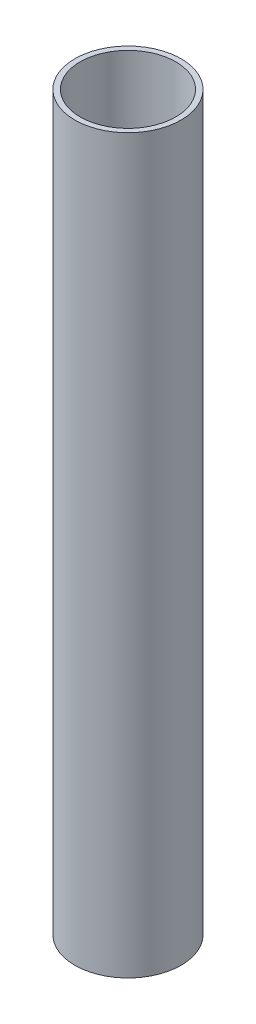
ISO-10303-21;
HEADER;
FILE_DESCRIPTION(('STEP AP214'),'2;1');
FILE_NAME('part.step','',(''),(''),'','','');
FILE_SCHEMA(('AUTOMOTIVE_DESIGN { 1 0 10303 214 1 1 1 1 }'));
ENDSEC;
DATA;
#1=APPLICATION_CONTEXT('core data for automotive mechanical design processes');
#2=APPLICATION_PROTOCOL_DEFINITION('international standard','automotive_design',2000,#1);
#3=PRODUCT_CONTEXT('',#1,'mechanical');
#4=PRODUCT('Part','Part','',(#3));
#5=PRODUCT_RELATED_PRODUCT_CATEGORY('part','',(#4));
#6=PRODUCT_DEFINITION_FORMATION('','',#4);
#7=PRODUCT_DEFINITION_CONTEXT('part definition',#1,'design');
#8=PRODUCT_DEFINITION('design','',#6,#7);
#9=PRODUCT_DEFINITION_SHAPE('','',#8);
#10=(LENGTH_UNIT() NAMED_UNIT(*) SI_UNIT(.MILLI.,.METRE.));
#11=(NAMED_UNIT(*) PLANE_ANGLE_UNIT() SI_UNIT($,.RADIAN.));
#12=(NAMED_UNIT(*) SI_UNIT($,.STERADIAN.) SOLID_ANGLE_UNIT());
#13=UNCERTAINTY_MEASURE_WITH_UNIT(LENGTH_MEASURE(1.E-05),#10,'distance_accuracy_value','');
#14=(GEOMETRIC_REPRESENTATION_CONTEXT(3) GLOBAL_UNCERTAINTY_ASSIGNED_CONTEXT((#13)) GLOBAL_UNIT_ASSIGNED_CONTEXT((#10,
#11,#12)) REPRESENTATION_CONTEXT('',''));
#15=CARTESIAN_POINT('',(0.,0.,0.));
#16=DIRECTION('',(0.,0.,1.));
#17=DIRECTION('',(1.,0.,0.));
#18=AXIS2_PLACEMENT_3D('',#15,#16,#17);
#19=CARTESIAN_POINT('',(0.,137.8,0.));
#20=DIRECTION('',(0.,1.,0.));
#21=DIRECTION('',(0.,0.,1.));
#22=AXIS2_PLACEMENT_3D('',#19,#20,#21);
#23=PLANE('',#22);
#24=CARTESIAN_POINT('',(0.,137.8,0.));
#25=DIRECTION('',(0.,1.,0.));
#26=DIRECTION('',(0.,0.,1.));
#27=AXIS2_PLACEMENT_3D('',#24,#25,#26);
#28=CIRCLE('',#27,10.);
#29=CARTESIAN_POINT('',(0.,137.8,10.));
#30=VERTEX_POINT('',#29);
#31=EDGE_CURVE('E10',#30,#30,#28,.T.);
#32=ORIENTED_EDGE('',*,*,#31,.T.);
#33=EDGE_LOOP('',(#32));
#34=FACE_BOUND('',#33,.T.);
#35=CARTESIAN_POINT('',(0.,137.8,0.));
#36=DIRECTION('',(0.,1.,0.));
#37=DIRECTION('',(0.,0.,1.));
#38=AXIS2_PLACEMENT_3D('',#35,#36,#37);
#39=CIRCLE('',#38,9.);
#40=CARTESIAN_POINT('',(0.,137.8,9.));
#41=VERTEX_POINT('',#40);
#42=EDGE_CURVE('E52',#41,#41,#39,.T.);
#43=ORIENTED_EDGE('',*,*,#42,.F.);
#44=EDGE_LOOP('',(#43));
#45=FACE_BOUND('',#44,.T.);
#46=ADVANCED_FACE('F39',(#34,#45),#23,.T.);
#47=CARTESIAN_POINT('',(0.,0.,0.));
#48=DIRECTION('',(0.,1.,0.));
#49=DIRECTION('',(0.,0.,1.));
#50=AXIS2_PLACEMENT_3D('',#47,#48,#49);
#51=PLANE('',#50);
#52=CARTESIAN_POINT('',(0.,0.,0.));
#53=DIRECTION('',(0.,1.,0.));
#54=DIRECTION('',(0.,0.,1.));
#55=AXIS2_PLACEMENT_3D('',#52,#53,#54);
#56=CIRCLE('',#55,10.);
#57=CARTESIAN_POINT('',(0.,0.,10.));
#58=VERTEX_POINT('',#57);
#59=EDGE_CURVE('E43',#58,#58,#56,.T.);
#60=ORIENTED_EDGE('',*,*,#59,.F.);
#61=EDGE_LOOP('',(#60));
#62=FACE_BOUND('',#61,.T.);
#63=CARTESIAN_POINT('',(0.,0.,0.));
#64=DIRECTION('',(0.,1.,0.));
#65=DIRECTION('',(0.,0.,1.));
#66=AXIS2_PLACEMENT_3D('',#63,#64,#65);
#67=CIRCLE('',#66,9.);
#68=CARTESIAN_POINT('',(0.,0.,9.));
#69=VERTEX_POINT('',#68);
#70=EDGE_CURVE('E54',#69,#69,#67,.T.);
#71=ORIENTED_EDGE('',*,*,#70,.T.);
#72=EDGE_LOOP('',(#71));
#73=FACE_BOUND('',#72,.T.);
#74=ADVANCED_FACE('F66',(#62,#73),#51,.F.);
#75=CARTESIAN_POINT('',(0.,137.8,0.));
#76=DIRECTION('',(0.,-1.,0.));
#77=DIRECTION('',(0.,0.,-1.));
#78=AXIS2_PLACEMENT_3D('',#75,#76,#77);
#79=CYLINDRICAL_SURFACE('',#78,10.);
#80=ORIENTED_EDGE('',*,*,#31,.F.);
#81=EDGE_LOOP('',(#80));
#82=FACE_BOUND('',#81,.T.);
#83=ORIENTED_EDGE('',*,*,#59,.T.);
#84=EDGE_LOOP('',(#83));
#85=FACE_BOUND('',#84,.T.);
#86=ADVANCED_FACE('F41',(#82,#85),#79,.T.);
#87=CARTESIAN_POINT('',(0.,137.8,0.));
#88=DIRECTION('',(0.,-1.,0.));
#89=DIRECTION('',(0.,0.,-1.));
#90=AXIS2_PLACEMENT_3D('',#87,#88,#89);
#91=CYLINDRICAL_SURFACE('',#90,9.);
#92=ORIENTED_EDGE('',*,*,#42,.T.);
#93=EDGE_LOOP('',(#92));
#94=FACE_BOUND('',#93,.T.);
#95=ORIENTED_EDGE('',*,*,#70,.F.);
#96=EDGE_LOOP('',(#95));
#97=FACE_BOUND('',#96,.T.);
#98=ADVANCED_FACE('F62',(#94,#97),#91,.F.);
#99=CLOSED_SHELL('',(#46,#74,#86,#98));
#100=MANIFOLD_SOLID_BREP('B2',#99);
#101=ADVANCED_BREP_SHAPE_REPRESENTATION('',(#18,#100),#14);
#102=SHAPE_DEFINITION_REPRESENTATION(#9,#101);
ENDSEC;
END-ISO-10303-21;
